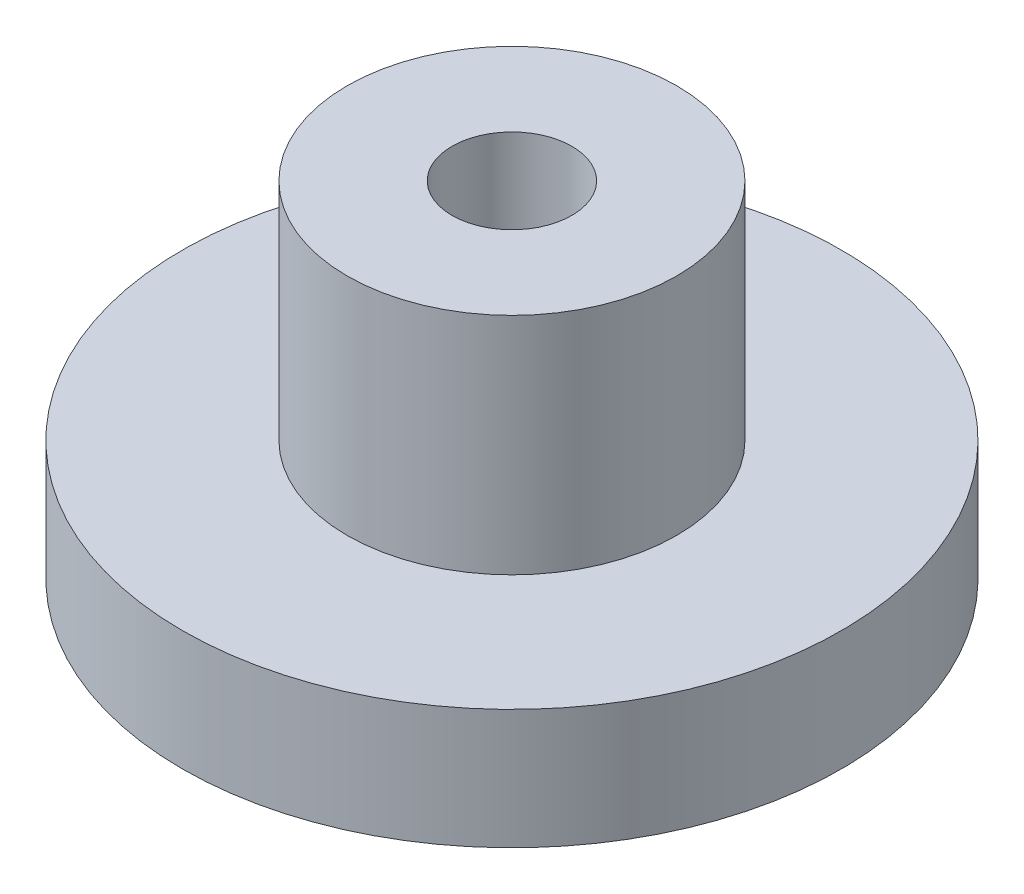
ISO-10303-21;
HEADER;
FILE_DESCRIPTION(('STEP AP214'),'2;1');
FILE_NAME('part.step','',(''),(''),'','','');
FILE_SCHEMA(('AUTOMOTIVE_DESIGN { 1 0 10303 214 1 1 1 1 }'));
ENDSEC;
DATA;
#1=APPLICATION_CONTEXT('core data for automotive mechanical design processes');
#2=APPLICATION_PROTOCOL_DEFINITION('international standard','automotive_design',2000,#1);
#3=PRODUCT_CONTEXT('',#1,'mechanical');
#4=PRODUCT('Part','Part','',(#3));
#5=PRODUCT_RELATED_PRODUCT_CATEGORY('part','',(#4));
#6=PRODUCT_DEFINITION_FORMATION('','',#4);
#7=PRODUCT_DEFINITION_CONTEXT('part definition',#1,'design');
#8=PRODUCT_DEFINITION('design','',#6,#7);
#9=PRODUCT_DEFINITION_SHAPE('','',#8);
#10=(LENGTH_UNIT() NAMED_UNIT(*) SI_UNIT(.MILLI.,.METRE.));
#11=(NAMED_UNIT(*) PLANE_ANGLE_UNIT() SI_UNIT($,.RADIAN.));
#12=(NAMED_UNIT(*) SI_UNIT($,.STERADIAN.) SOLID_ANGLE_UNIT());
#13=UNCERTAINTY_MEASURE_WITH_UNIT(LENGTH_MEASURE(1.E-05),#10,'distance_accuracy_value','');
#14=(GEOMETRIC_REPRESENTATION_CONTEXT(3) GLOBAL_UNCERTAINTY_ASSIGNED_CONTEXT((#13)) GLOBAL_UNIT_ASSIGNED_CONTEXT((#10,
#11,#12)) REPRESENTATION_CONTEXT('',''));
#15=CARTESIAN_POINT('',(0.,0.,0.));
#16=DIRECTION('',(0.,0.,1.));
#17=DIRECTION('',(1.,0.,0.));
#18=AXIS2_PLACEMENT_3D('',#15,#16,#17);
#19=CARTESIAN_POINT('',(0.,0.,0.));
#20=DIRECTION('',(0.,1.,0.));
#21=DIRECTION('',(0.,0.,1.));
#22=AXIS2_PLACEMENT_3D('',#19,#20,#21);
#23=PLANE('',#22);
#24=CARTESIAN_POINT('',(0.,0.,0.));
#25=DIRECTION('',(0.,1.,0.));
#26=DIRECTION('',(0.,0.,1.));
#27=AXIS2_PLACEMENT_3D('',#24,#25,#26);
#28=CIRCLE('',#27,5.5);
#29=CARTESIAN_POINT('',(0.,0.,5.5));
#30=VERTEX_POINT('',#29);
#31=EDGE_CURVE('E67',#30,#30,#28,.T.);
#32=ORIENTED_EDGE('',*,*,#31,.T.);
#33=EDGE_LOOP('',(#32));
#34=FACE_BOUND('',#33,.T.);
#35=CARTESIAN_POINT('',(0.,0.,0.));
#36=DIRECTION('',(0.,1.,0.));
#37=DIRECTION('',(0.,0.,1.));
#38=AXIS2_PLACEMENT_3D('',#35,#36,#37);
#39=CIRCLE('',#38,2.);
#40=CARTESIAN_POINT('',(0.,0.,2.));
#41=VERTEX_POINT('',#40);
#42=EDGE_CURVE('E10',#41,#41,#39,.T.);
#43=ORIENTED_EDGE('',*,*,#42,.F.);
#44=EDGE_LOOP('',(#43));
#45=FACE_BOUND('',#44,.T.);
#46=ADVANCED_FACE('F39',(#34,#45),#23,.T.);
#47=CARTESIAN_POINT('',(0.,0.,0.));
#48=DIRECTION('',(0.,1.,0.));
#49=DIRECTION('',(0.,0.,1.));
#50=AXIS2_PLACEMENT_3D('',#47,#48,#49);
#51=CYLINDRICAL_SURFACE('',#50,2.);
#52=CARTESIAN_POINT('',(0.,-8.9,0.));
#53=DIRECTION('',(0.,1.,0.));
#54=DIRECTION('',(0.,0.,1.));
#55=AXIS2_PLACEMENT_3D('',#52,#53,#54);
#56=CIRCLE('',#55,2.);
#57=CARTESIAN_POINT('',(0.,-8.9,2.));
#58=VERTEX_POINT('',#57);
#59=EDGE_CURVE('E45',#58,#58,#56,.T.);
#60=ORIENTED_EDGE('',*,*,#59,.F.);
#61=EDGE_LOOP('',(#60));
#62=FACE_BOUND('',#61,.T.);
#63=ORIENTED_EDGE('',*,*,#42,.T.);
#64=EDGE_LOOP('',(#63));
#65=FACE_BOUND('',#64,.T.);
#66=ADVANCED_FACE('F85',(#62,#65),#51,.F.);
#67=CARTESIAN_POINT('',(0.,-8.9,0.));
#68=DIRECTION('',(0.,1.,0.));
#69=DIRECTION('',(0.,0.,1.));
#70=AXIS2_PLACEMENT_3D('',#67,#68,#69);
#71=PLANE('',#70);
#72=CARTESIAN_POINT('',(0.,-8.9,0.));
#73=DIRECTION('',(0.,1.,0.));
#74=DIRECTION('',(0.,0.,1.));
#75=AXIS2_PLACEMENT_3D('',#72,#73,#74);
#76=CIRCLE('',#75,3.1);
#77=CARTESIAN_POINT('',(0.,-8.9,3.1));
#78=VERTEX_POINT('',#77);
#79=EDGE_CURVE('E49',#78,#78,#76,.T.);
#80=ORIENTED_EDGE('',*,*,#79,.F.);
#81=EDGE_LOOP('',(#80));
#82=FACE_BOUND('',#81,.T.);
#83=ORIENTED_EDGE('',*,*,#59,.T.);
#84=EDGE_LOOP('',(#83));
#85=FACE_BOUND('',#84,.T.);
#86=ADVANCED_FACE('F89',(#82,#85),#71,.F.);
#87=CARTESIAN_POINT('',(0.,0.,0.));
#88=DIRECTION('',(0.,1.,0.));
#89=DIRECTION('',(0.,0.,1.));
#90=AXIS2_PLACEMENT_3D('',#87,#88,#89);
#91=CYLINDRICAL_SURFACE('',#90,3.1);
#92=ORIENTED_EDGE('',*,*,#79,.T.);
#93=EDGE_LOOP('',(#92));
#94=FACE_BOUND('',#93,.T.);
#95=CARTESIAN_POINT('',(0.,-11.5,0.));
#96=DIRECTION('',(0.,1.,0.));
#97=DIRECTION('',(0.,0.,1.));
#98=AXIS2_PLACEMENT_3D('',#95,#96,#97);
#99=CIRCLE('',#98,3.1);
#100=CARTESIAN_POINT('',(0.,-11.5,3.1));
#101=VERTEX_POINT('',#100);
#102=EDGE_CURVE('E53',#101,#101,#99,.T.);
#103=ORIENTED_EDGE('',*,*,#102,.F.);
#104=EDGE_LOOP('',(#103));
#105=FACE_BOUND('',#104,.T.);
#106=ADVANCED_FACE('F94',(#94,#105),#91,.F.);
#107=CARTESIAN_POINT('',(0.,-11.5,0.));
#108=DIRECTION('',(0.,1.,0.));
#109=DIRECTION('',(0.,0.,1.));
#110=AXIS2_PLACEMENT_3D('',#107,#108,#109);
#111=PLANE('',#110);
#112=CARTESIAN_POINT('',(0.,-11.5,0.));
#113=DIRECTION('',(0.,1.,0.));
#114=DIRECTION('',(0.,0.,1.));
#115=AXIS2_PLACEMENT_3D('',#112,#113,#114);
#116=CIRCLE('',#115,11.);
#117=CARTESIAN_POINT('',(0.,-11.5,11.));
#118=VERTEX_POINT('',#117);
#119=EDGE_CURVE('E58',#118,#118,#116,.T.);
#120=ORIENTED_EDGE('',*,*,#119,.F.);
#121=EDGE_LOOP('',(#120));
#122=FACE_BOUND('',#121,.T.);
#123=ORIENTED_EDGE('',*,*,#102,.T.);
#124=EDGE_LOOP('',(#123));
#125=FACE_BOUND('',#124,.T.);
#126=ADVANCED_FACE('F100',(#122,#125),#111,.F.);
#127=CARTESIAN_POINT('',(0.,0.,0.));
#128=DIRECTION('',(0.,1.,0.));
#129=DIRECTION('',(0.,0.,1.));
#130=AXIS2_PLACEMENT_3D('',#127,#128,#129);
#131=CYLINDRICAL_SURFACE('',#130,11.);
#132=ORIENTED_EDGE('',*,*,#119,.T.);
#133=EDGE_LOOP('',(#132));
#134=FACE_BOUND('',#133,.T.);
#135=CARTESIAN_POINT('',(0.,-7.5,0.));
#136=DIRECTION('',(0.,1.,0.));
#137=DIRECTION('',(0.,0.,1.));
#138=AXIS2_PLACEMENT_3D('',#135,#136,#137);
#139=CIRCLE('',#138,11.);
#140=CARTESIAN_POINT('',(0.,-7.5,11.));
#141=VERTEX_POINT('',#140);
#142=EDGE_CURVE('E61',#141,#141,#139,.T.);
#143=ORIENTED_EDGE('',*,*,#142,.F.);
#144=EDGE_LOOP('',(#143));
#145=FACE_BOUND('',#144,.T.);
#146=ADVANCED_FACE('F81',(#134,#145),#131,.T.);
#147=CARTESIAN_POINT('',(0.,-7.5,0.));
#148=DIRECTION('',(0.,1.,0.));
#149=DIRECTION('',(0.,0.,1.));
#150=AXIS2_PLACEMENT_3D('',#147,#148,#149);
#151=PLANE('',#150);
#152=ORIENTED_EDGE('',*,*,#142,.T.);
#153=EDGE_LOOP('',(#152));
#154=FACE_BOUND('',#153,.T.);
#155=CARTESIAN_POINT('',(0.,-7.5,0.));
#156=DIRECTION('',(0.,1.,0.));
#157=DIRECTION('',(0.,0.,1.));
#158=AXIS2_PLACEMENT_3D('',#155,#156,#157);
#159=CIRCLE('',#158,5.5);
#160=CARTESIAN_POINT('',(0.,-7.5,5.5));
#161=VERTEX_POINT('',#160);
#162=EDGE_CURVE('E64',#161,#161,#159,.T.);
#163=ORIENTED_EDGE('',*,*,#162,.F.);
#164=EDGE_LOOP('',(#163));
#165=FACE_BOUND('',#164,.T.);
#166=ADVANCED_FACE('F75',(#154,#165),#151,.T.);
#167=CARTESIAN_POINT('',(0.,0.,0.));
#168=DIRECTION('',(0.,1.,0.));
#169=DIRECTION('',(0.,0.,1.));
#170=AXIS2_PLACEMENT_3D('',#167,#168,#169);
#171=CYLINDRICAL_SURFACE('',#170,5.5);
#172=ORIENTED_EDGE('',*,*,#162,.T.);
#173=EDGE_LOOP('',(#172));
#174=FACE_BOUND('',#173,.T.);
#175=ORIENTED_EDGE('',*,*,#31,.F.);
#176=EDGE_LOOP('',(#175));
#177=FACE_BOUND('',#176,.T.);
#178=ADVANCED_FACE('F73',(#174,#177),#171,.T.);
#179=CLOSED_SHELL('',(#46,#66,#86,#106,#126,#146,#166,#178));
#180=MANIFOLD_SOLID_BREP('B2',#179);
#181=ADVANCED_BREP_SHAPE_REPRESENTATION('',(#18,#180),#14);
#182=SHAPE_DEFINITION_REPRESENTATION(#9,#181);
ENDSEC;
END-ISO-10303-21;
